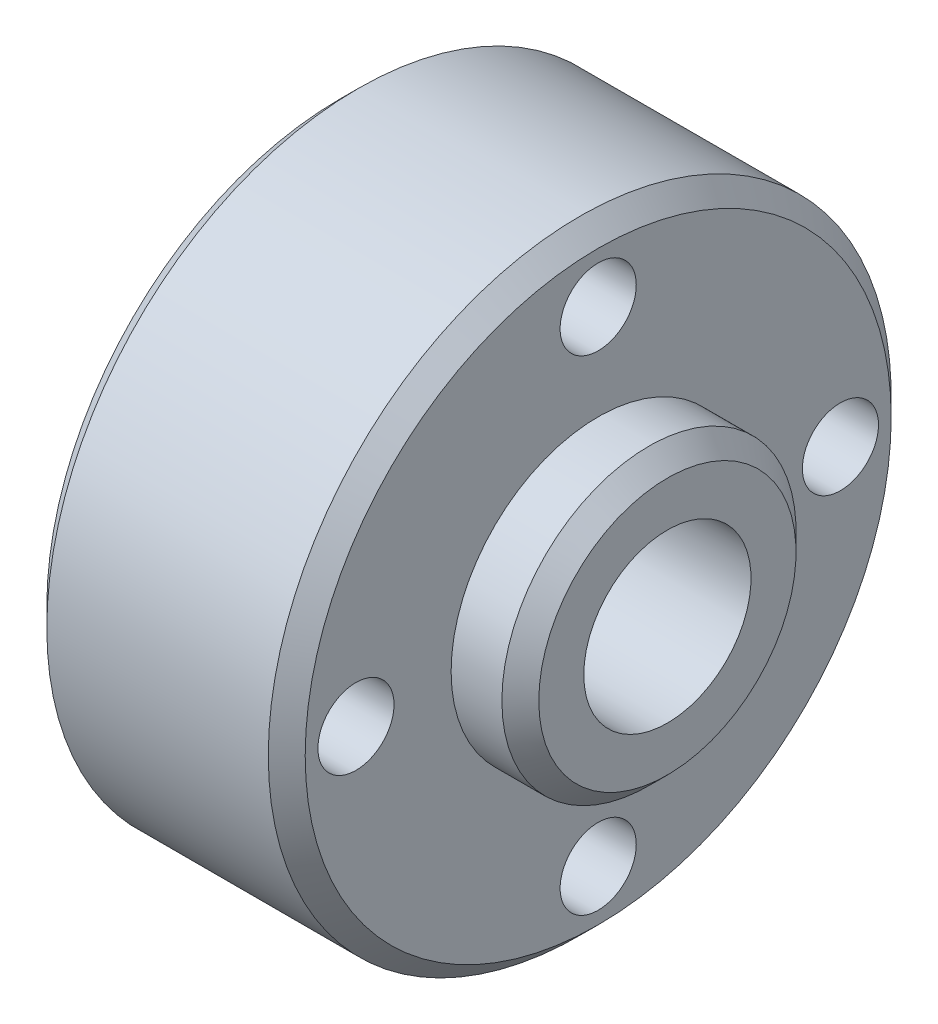
ISO-10303-21;
HEADER;
FILE_DESCRIPTION(('STEP AP214'),'2;1');
FILE_NAME('part.step','',(''),(''),'','','');
FILE_SCHEMA(('AUTOMOTIVE_DESIGN { 1 0 10303 214 1 1 1 1 }'));
ENDSEC;
DATA;
#1=APPLICATION_CONTEXT('core data for automotive mechanical design processes');
#2=APPLICATION_PROTOCOL_DEFINITION('international standard','automotive_design',2000,#1);
#3=PRODUCT_CONTEXT('',#1,'mechanical');
#4=PRODUCT('Part','Part','',(#3));
#5=PRODUCT_RELATED_PRODUCT_CATEGORY('part','',(#4));
#6=PRODUCT_DEFINITION_FORMATION('','',#4);
#7=PRODUCT_DEFINITION_CONTEXT('part definition',#1,'design');
#8=PRODUCT_DEFINITION('design','',#6,#7);
#9=PRODUCT_DEFINITION_SHAPE('','',#8);
#10=(LENGTH_UNIT() NAMED_UNIT(*) SI_UNIT(.MILLI.,.METRE.));
#11=(NAMED_UNIT(*) PLANE_ANGLE_UNIT() SI_UNIT($,.RADIAN.));
#12=(NAMED_UNIT(*) SI_UNIT($,.STERADIAN.) SOLID_ANGLE_UNIT());
#13=UNCERTAINTY_MEASURE_WITH_UNIT(LENGTH_MEASURE(1.E-05),#10,'distance_accuracy_value','');
#14=(GEOMETRIC_REPRESENTATION_CONTEXT(3) GLOBAL_UNCERTAINTY_ASSIGNED_CONTEXT((#13)) GLOBAL_UNIT_ASSIGNED_CONTEXT((#10,
#11,#12)) REPRESENTATION_CONTEXT('',''));
#15=CARTESIAN_POINT('',(0.,0.,0.));
#16=DIRECTION('',(0.,0.,1.));
#17=DIRECTION('',(1.,0.,0.));
#18=AXIS2_PLACEMENT_3D('',#15,#16,#17);
#19=CARTESIAN_POINT('',(7.,3.625,0.));
#20=DIRECTION('',(1.,0.,0.));
#21=DIRECTION('',(0.,0.,-1.));
#22=AXIS2_PLACEMENT_3D('',#19,#20,#21);
#23=PLANE('',#22);
#24=CARTESIAN_POINT('',(7.,0.,0.));
#25=DIRECTION('',(-1.,0.,0.));
#26=DIRECTION('',(0.,0.,1.));
#27=AXIS2_PLACEMENT_3D('',#24,#25,#26);
#28=CIRCLE('',#27,3.625);
#29=CARTESIAN_POINT('',(7.,0.,3.625));
#30=VERTEX_POINT('',#29);
#31=EDGE_CURVE('E64',#30,#30,#28,.T.);
#32=ORIENTED_EDGE('',*,*,#31,.F.);
#33=EDGE_LOOP('',(#32));
#34=FACE_BOUND('',#33,.T.);
#35=CARTESIAN_POINT('',(7.,0.,0.));
#36=DIRECTION('',(-1.,0.,0.));
#37=DIRECTION('',(0.,0.,1.));
#38=AXIS2_PLACEMENT_3D('',#35,#36,#37);
#39=CIRCLE('',#38,7.625);
#40=CARTESIAN_POINT('',(7.,0.,7.625));
#41=VERTEX_POINT('',#40);
#42=EDGE_CURVE('E73',#41,#41,#39,.T.);
#43=ORIENTED_EDGE('',*,*,#42,.T.);
#44=EDGE_LOOP('',(#43));
#45=FACE_BOUND('',#44,.T.);
#46=ADVANCED_FACE('F32',(#34,#45),#23,.F.);
#47=CARTESIAN_POINT('',(0.,0.,0.));
#48=DIRECTION('',(-1.,0.,0.));
#49=DIRECTION('',(0.,0.,1.));
#50=AXIS2_PLACEMENT_3D('',#47,#48,#49);
#51=CYLINDRICAL_SURFACE('',#50,3.625);
#52=CARTESIAN_POINT('',(14.2,0.,0.));
#53=DIRECTION('',(-1.,0.,0.));
#54=DIRECTION('',(0.,0.,1.));
#55=AXIS2_PLACEMENT_3D('',#52,#53,#54);
#56=CIRCLE('',#55,3.625);
#57=CARTESIAN_POINT('',(14.2,0.,3.625));
#58=VERTEX_POINT('',#57);
#59=EDGE_CURVE('E67',#58,#58,#56,.T.);
#60=ORIENTED_EDGE('',*,*,#59,.F.);
#61=EDGE_LOOP('',(#60));
#62=FACE_BOUND('',#61,.T.);
#63=ORIENTED_EDGE('',*,*,#31,.T.);
#64=EDGE_LOOP('',(#63));
#65=FACE_BOUND('',#64,.T.);
#66=ADVANCED_FACE('F134',(#62,#65),#51,.F.);
#67=CARTESIAN_POINT('',(14.2,6.375,0.));
#68=DIRECTION('',(-1.,0.,0.));
#69=DIRECTION('',(0.,0.,1.));
#70=AXIS2_PLACEMENT_3D('',#67,#68,#69);
#71=PLANE('',#70);
#72=CARTESIAN_POINT('',(14.2,0.,0.));
#73=DIRECTION('',(-1.,0.,0.));
#74=DIRECTION('',(0.,0.,1.));
#75=AXIS2_PLACEMENT_3D('',#72,#73,#74);
#76=CIRCLE('',#75,5.57499999999999);
#77=CARTESIAN_POINT('',(14.2,0.,5.57499999999999));
#78=VERTEX_POINT('',#77);
#79=EDGE_CURVE('E39',#78,#78,#76,.F.);
#80=ORIENTED_EDGE('',*,*,#79,.T.);
#81=EDGE_LOOP('',(#80));
#82=FACE_BOUND('',#81,.T.);
#83=ORIENTED_EDGE('',*,*,#59,.T.);
#84=EDGE_LOOP('',(#83));
#85=FACE_BOUND('',#84,.T.);
#86=ADVANCED_FACE('F128',(#82,#85),#71,.F.);
#87=CARTESIAN_POINT('',(0.,0.,0.));
#88=DIRECTION('',(-1.,0.,0.));
#89=DIRECTION('',(0.,0.,1.));
#90=AXIS2_PLACEMENT_3D('',#87,#88,#89);
#91=CYLINDRICAL_SURFACE('',#90,6.375);
#92=CARTESIAN_POINT('',(13.4,0.,0.));
#93=DIRECTION('',(-1.,0.,0.));
#94=DIRECTION('',(0.,0.,1.));
#95=AXIS2_PLACEMENT_3D('',#92,#93,#94);
#96=CIRCLE('',#95,6.375);
#97=CARTESIAN_POINT('',(13.4,0.,6.375));
#98=VERTEX_POINT('',#97);
#99=EDGE_CURVE('E43',#98,#98,#96,.T.);
#100=ORIENTED_EDGE('',*,*,#99,.T.);
#101=EDGE_LOOP('',(#100));
#102=FACE_BOUND('',#101,.T.);
#103=CARTESIAN_POINT('',(11.2,0.,0.));
#104=DIRECTION('',(-1.,0.,0.));
#105=DIRECTION('',(0.,0.,1.));
#106=AXIS2_PLACEMENT_3D('',#103,#104,#105);
#107=CIRCLE('',#106,6.375);
#108=CARTESIAN_POINT('',(11.2,0.,6.375));
#109=VERTEX_POINT('',#108);
#110=EDGE_CURVE('E70',#109,#109,#107,.T.);
#111=ORIENTED_EDGE('',*,*,#110,.F.);
#112=EDGE_LOOP('',(#111));
#113=FACE_BOUND('',#112,.T.);
#114=ADVANCED_FACE('F116',(#102,#113),#91,.T.);
#115=CARTESIAN_POINT('',(11.2,13.5,0.));
#116=DIRECTION('',(-1.,0.,0.));
#117=DIRECTION('',(0.,0.,1.));
#118=AXIS2_PLACEMENT_3D('',#115,#116,#117);
#119=PLANE('',#118);
#120=CARTESIAN_POINT('',(11.2,0.,0.));
#121=DIRECTION('',(-1.,0.,0.));
#122=DIRECTION('',(0.,0.,1.));
#123=AXIS2_PLACEMENT_3D('',#120,#121,#122);
#124=CIRCLE('',#123,12.7);
#125=CARTESIAN_POINT('',(11.2,0.,12.7));
#126=VERTEX_POINT('',#125);
#127=EDGE_CURVE('E55',#126,#126,#124,.F.);
#128=ORIENTED_EDGE('',*,*,#127,.T.);
#129=EDGE_LOOP('',(#128));
#130=FACE_BOUND('',#129,.T.);
#131=CARTESIAN_POINT('',(11.2,10.5,0.));
#132=DIRECTION('',(1.,0.,0.));
#133=DIRECTION('',(0.,0.,-1.));
#134=AXIS2_PLACEMENT_3D('',#131,#132,#133);
#135=CIRCLE('',#134,1.65);
#136=CARTESIAN_POINT('',(11.2,10.5,-1.65));
#137=VERTEX_POINT('',#136);
#138=EDGE_CURVE('E95',#137,#137,#135,.T.);
#139=ORIENTED_EDGE('',*,*,#138,.F.);
#140=EDGE_LOOP('',(#139));
#141=FACE_BOUND('',#140,.T.);
#142=CARTESIAN_POINT('',(11.2,0.,-10.5));
#143=DIRECTION('',(1.,0.,0.));
#144=DIRECTION('',(0.,0.,-1.));
#145=AXIS2_PLACEMENT_3D('',#142,#143,#144);
#146=CIRCLE('',#145,1.65);
#147=CARTESIAN_POINT('',(11.2,0.,-12.15));
#148=VERTEX_POINT('',#147);
#149=EDGE_CURVE('E89',#148,#148,#146,.T.);
#150=ORIENTED_EDGE('',*,*,#149,.F.);
#151=EDGE_LOOP('',(#150));
#152=FACE_BOUND('',#151,.T.);
#153=CARTESIAN_POINT('',(11.2,-10.5,0.));
#154=DIRECTION('',(1.,0.,0.));
#155=DIRECTION('',(0.,0.,-1.));
#156=AXIS2_PLACEMENT_3D('',#153,#154,#155);
#157=CIRCLE('',#156,1.65);
#158=CARTESIAN_POINT('',(11.2,-10.5,-1.65));
#159=VERTEX_POINT('',#158);
#160=EDGE_CURVE('E83',#159,#159,#157,.T.);
#161=ORIENTED_EDGE('',*,*,#160,.F.);
#162=EDGE_LOOP('',(#161));
#163=FACE_BOUND('',#162,.T.);
#164=CARTESIAN_POINT('',(11.2,0.,10.5));
#165=DIRECTION('',(1.,0.,0.));
#166=DIRECTION('',(0.,0.,-1.));
#167=AXIS2_PLACEMENT_3D('',#164,#165,#166);
#168=CIRCLE('',#167,1.65);
#169=CARTESIAN_POINT('',(11.2,0.,8.85));
#170=VERTEX_POINT('',#169);
#171=EDGE_CURVE('E77',#170,#170,#168,.T.);
#172=ORIENTED_EDGE('',*,*,#171,.F.);
#173=EDGE_LOOP('',(#172));
#174=FACE_BOUND('',#173,.T.);
#175=ORIENTED_EDGE('',*,*,#110,.T.);
#176=EDGE_LOOP('',(#175));
#177=FACE_BOUND('',#176,.T.);
#178=ADVANCED_FACE('F112',(#130,#141,#152,#163,#174,#177),#119,.F.);
#179=CARTESIAN_POINT('',(0.,0.,0.));
#180=DIRECTION('',(-1.,0.,0.));
#181=DIRECTION('',(0.,0.,1.));
#182=AXIS2_PLACEMENT_3D('',#179,#180,#181);
#183=CYLINDRICAL_SURFACE('',#182,13.5);
#184=CARTESIAN_POINT('',(10.4,0.,0.));
#185=DIRECTION('',(-1.,0.,0.));
#186=DIRECTION('',(0.,0.,1.));
#187=AXIS2_PLACEMENT_3D('',#184,#185,#186);
#188=CIRCLE('',#187,13.5);
#189=CARTESIAN_POINT('',(10.4,0.,13.5));
#190=VERTEX_POINT('',#189);
#191=EDGE_CURVE('E58',#190,#190,#188,.T.);
#192=ORIENTED_EDGE('',*,*,#191,.T.);
#193=EDGE_LOOP('',(#192));
#194=FACE_BOUND('',#193,.T.);
#195=CARTESIAN_POINT('',(0.8,0.,0.));
#196=DIRECTION('',(1.,0.,0.));
#197=DIRECTION('',(0.,0.,-1.));
#198=AXIS2_PLACEMENT_3D('',#195,#196,#197);
#199=CIRCLE('',#198,13.5);
#200=CARTESIAN_POINT('',(0.8,0.,-13.5));
#201=VERTEX_POINT('',#200);
#202=EDGE_CURVE('E61',#201,#201,#199,.T.);
#203=ORIENTED_EDGE('',*,*,#202,.T.);
#204=EDGE_LOOP('',(#203));
#205=FACE_BOUND('',#204,.T.);
#206=ADVANCED_FACE('F115',(#194,#205),#183,.T.);
#207=CARTESIAN_POINT('',(0.,7.625,0.));
#208=DIRECTION('',(1.,0.,0.));
#209=DIRECTION('',(0.,0.,-1.));
#210=AXIS2_PLACEMENT_3D('',#207,#208,#209);
#211=PLANE('',#210);
#212=CARTESIAN_POINT('',(0.,0.,0.));
#213=DIRECTION('',(1.,0.,0.));
#214=DIRECTION('',(0.,0.,-1.));
#215=AXIS2_PLACEMENT_3D('',#212,#213,#214);
#216=CIRCLE('',#215,12.7);
#217=CARTESIAN_POINT('',(0.,0.,-12.7));
#218=VERTEX_POINT('',#217);
#219=EDGE_CURVE('E47',#218,#218,#216,.F.);
#220=ORIENTED_EDGE('',*,*,#219,.T.);
#221=EDGE_LOOP('',(#220));
#222=FACE_BOUND('',#221,.T.);
#223=CARTESIAN_POINT('',(0.,0.,0.));
#224=DIRECTION('',(1.,0.,0.));
#225=DIRECTION('',(0.,0.,-1.));
#226=AXIS2_PLACEMENT_3D('',#223,#224,#225);
#227=CIRCLE('',#226,8.425);
#228=CARTESIAN_POINT('',(0.,0.,-8.425));
#229=VERTEX_POINT('',#228);
#230=EDGE_CURVE('E52',#229,#229,#227,.T.);
#231=ORIENTED_EDGE('',*,*,#230,.T.);
#232=EDGE_LOOP('',(#231));
#233=FACE_BOUND('',#232,.T.);
#234=CARTESIAN_POINT('',(0.,10.5,0.));
#235=DIRECTION('',(1.,0.,0.));
#236=DIRECTION('',(0.,0.,-1.));
#237=AXIS2_PLACEMENT_3D('',#234,#235,#236);
#238=CIRCLE('',#237,1.65);
#239=CARTESIAN_POINT('',(0.,10.5,-1.65));
#240=VERTEX_POINT('',#239);
#241=EDGE_CURVE('E76',#240,#240,#238,.T.);
#242=ORIENTED_EDGE('',*,*,#241,.T.);
#243=EDGE_LOOP('',(#242));
#244=FACE_BOUND('',#243,.T.);
#245=CARTESIAN_POINT('',(0.,0.,-10.5));
#246=DIRECTION('',(1.,0.,0.));
#247=DIRECTION('',(0.,0.,-1.));
#248=AXIS2_PLACEMENT_3D('',#245,#246,#247);
#249=CIRCLE('',#248,1.65);
#250=CARTESIAN_POINT('',(0.,0.,-12.15));
#251=VERTEX_POINT('',#250);
#252=EDGE_CURVE('E92',#251,#251,#249,.T.);
#253=ORIENTED_EDGE('',*,*,#252,.T.);
#254=EDGE_LOOP('',(#253));
#255=FACE_BOUND('',#254,.T.);
#256=CARTESIAN_POINT('',(0.,-10.5,0.));
#257=DIRECTION('',(1.,0.,0.));
#258=DIRECTION('',(0.,0.,-1.));
#259=AXIS2_PLACEMENT_3D('',#256,#257,#258);
#260=CIRCLE('',#259,1.65);
#261=CARTESIAN_POINT('',(0.,-10.5,-1.65));
#262=VERTEX_POINT('',#261);
#263=EDGE_CURVE('E86',#262,#262,#260,.T.);
#264=ORIENTED_EDGE('',*,*,#263,.T.);
#265=EDGE_LOOP('',(#264));
#266=FACE_BOUND('',#265,.T.);
#267=CARTESIAN_POINT('',(0.,0.,10.5));
#268=DIRECTION('',(1.,0.,0.));
#269=DIRECTION('',(0.,0.,-1.));
#270=AXIS2_PLACEMENT_3D('',#267,#268,#269);
#271=CIRCLE('',#270,1.65);
#272=CARTESIAN_POINT('',(0.,0.,8.85));
#273=VERTEX_POINT('',#272);
#274=EDGE_CURVE('E80',#273,#273,#271,.T.);
#275=ORIENTED_EDGE('',*,*,#274,.T.);
#276=EDGE_LOOP('',(#275));
#277=FACE_BOUND('',#276,.T.);
#278=ADVANCED_FACE('F101',(#222,#233,#244,#255,#266,#277),#211,.F.);
#279=CARTESIAN_POINT('',(0.,0.,0.));
#280=DIRECTION('',(-1.,0.,0.));
#281=DIRECTION('',(0.,0.,1.));
#282=AXIS2_PLACEMENT_3D('',#279,#280,#281);
#283=CYLINDRICAL_SURFACE('',#282,7.625);
#284=CARTESIAN_POINT('',(0.800000000000004,0.,0.));
#285=DIRECTION('',(1.,0.,0.));
#286=DIRECTION('',(0.,0.,-1.));
#287=AXIS2_PLACEMENT_3D('',#284,#285,#286);
#288=CIRCLE('',#287,7.625);
#289=CARTESIAN_POINT('',(0.800000000000004,0.,-7.625));
#290=VERTEX_POINT('',#289);
#291=EDGE_CURVE('E10',#290,#290,#288,.F.);
#292=ORIENTED_EDGE('',*,*,#291,.T.);
#293=EDGE_LOOP('',(#292));
#294=FACE_BOUND('',#293,.T.);
#295=ORIENTED_EDGE('',*,*,#42,.F.);
#296=EDGE_LOOP('',(#295));
#297=FACE_BOUND('',#296,.T.);
#298=ADVANCED_FACE('F168',(#294,#297),#283,.F.);
#299=CARTESIAN_POINT('',(0.,0.,10.5));
#300=DIRECTION('',(1.,0.,0.));
#301=DIRECTION('',(0.,0.,-1.));
#302=AXIS2_PLACEMENT_3D('',#299,#300,#301);
#303=CYLINDRICAL_SURFACE('',#302,1.65);
#304=ORIENTED_EDGE('',*,*,#274,.F.);
#305=EDGE_LOOP('',(#304));
#306=FACE_BOUND('',#305,.T.);
#307=ORIENTED_EDGE('',*,*,#171,.T.);
#308=EDGE_LOOP('',(#307));
#309=FACE_BOUND('',#308,.T.);
#310=ADVANCED_FACE('F175',(#306,#309),#303,.F.);
#311=CARTESIAN_POINT('',(0.,-10.5,0.));
#312=DIRECTION('',(1.,0.,0.));
#313=DIRECTION('',(0.,0.,-1.));
#314=AXIS2_PLACEMENT_3D('',#311,#312,#313);
#315=CYLINDRICAL_SURFACE('',#314,1.65);
#316=ORIENTED_EDGE('',*,*,#263,.F.);
#317=EDGE_LOOP('',(#316));
#318=FACE_BOUND('',#317,.T.);
#319=ORIENTED_EDGE('',*,*,#160,.T.);
#320=EDGE_LOOP('',(#319));
#321=FACE_BOUND('',#320,.T.);
#322=ADVANCED_FACE('F182',(#318,#321),#315,.F.);
#323=CARTESIAN_POINT('',(0.,0.,-10.5));
#324=DIRECTION('',(1.,0.,0.));
#325=DIRECTION('',(0.,0.,-1.));
#326=AXIS2_PLACEMENT_3D('',#323,#324,#325);
#327=CYLINDRICAL_SURFACE('',#326,1.65);
#328=ORIENTED_EDGE('',*,*,#252,.F.);
#329=EDGE_LOOP('',(#328));
#330=FACE_BOUND('',#329,.T.);
#331=ORIENTED_EDGE('',*,*,#149,.T.);
#332=EDGE_LOOP('',(#331));
#333=FACE_BOUND('',#332,.T.);
#334=ADVANCED_FACE('F108',(#330,#333),#327,.F.);
#335=CARTESIAN_POINT('',(0.,10.5,0.));
#336=DIRECTION('',(1.,0.,0.));
#337=DIRECTION('',(0.,0.,-1.));
#338=AXIS2_PLACEMENT_3D('',#335,#336,#337);
#339=CYLINDRICAL_SURFACE('',#338,1.65);
#340=ORIENTED_EDGE('',*,*,#241,.F.);
#341=EDGE_LOOP('',(#340));
#342=FACE_BOUND('',#341,.T.);
#343=ORIENTED_EDGE('',*,*,#138,.T.);
#344=EDGE_LOOP('',(#343));
#345=FACE_BOUND('',#344,.T.);
#346=ADVANCED_FACE('F104',(#342,#345),#339,.F.);
#347=CARTESIAN_POINT('',(10.4,0.,0.));
#348=DIRECTION('',(-1.,0.,0.));
#349=DIRECTION('',(0.,0.,1.));
#350=AXIS2_PLACEMENT_3D('',#347,#348,#349);
#351=CONICAL_SURFACE('',#350,13.5,0.785398163397449);
#352=ORIENTED_EDGE('',*,*,#127,.F.);
#353=EDGE_LOOP('',(#352));
#354=FACE_BOUND('',#353,.T.);
#355=ORIENTED_EDGE('',*,*,#191,.F.);
#356=EDGE_LOOP('',(#355));
#357=FACE_BOUND('',#356,.T.);
#358=ADVANCED_FACE('F107',(#354,#357),#351,.T.);
#359=CARTESIAN_POINT('',(0.,0.,0.));
#360=DIRECTION('',(1.,0.,0.));
#361=DIRECTION('',(0.,0.,-1.));
#362=AXIS2_PLACEMENT_3D('',#359,#360,#361);
#363=CONICAL_SURFACE('',#362,12.7,0.785398163397442);
#364=ORIENTED_EDGE('',*,*,#202,.F.);
#365=EDGE_LOOP('',(#364));
#366=FACE_BOUND('',#365,.T.);
#367=ORIENTED_EDGE('',*,*,#219,.F.);
#368=EDGE_LOOP('',(#367));
#369=FACE_BOUND('',#368,.T.);
#370=ADVANCED_FACE('F149',(#366,#369),#363,.T.);
#371=CARTESIAN_POINT('',(13.4,0.,0.));
#372=DIRECTION('',(-1.,0.,0.));
#373=DIRECTION('',(0.,0.,1.));
#374=AXIS2_PLACEMENT_3D('',#371,#372,#373);
#375=CONICAL_SURFACE('',#374,6.375,0.785398163397452);
#376=ORIENTED_EDGE('',*,*,#79,.F.);
#377=EDGE_LOOP('',(#376));
#378=FACE_BOUND('',#377,.T.);
#379=ORIENTED_EDGE('',*,*,#99,.F.);
#380=EDGE_LOOP('',(#379));
#381=FACE_BOUND('',#380,.T.);
#382=ADVANCED_FACE('F152',(#378,#381),#375,.T.);
#383=CARTESIAN_POINT('',(0.800000000000004,0.,0.));
#384=DIRECTION('',(-1.,0.,0.));
#385=DIRECTION('',(0.,0.,1.));
#386=AXIS2_PLACEMENT_3D('',#383,#384,#385);
#387=CONICAL_SURFACE('',#386,7.625,0.785398163397447);
#388=ORIENTED_EDGE('',*,*,#230,.F.);
#389=EDGE_LOOP('',(#388));
#390=FACE_BOUND('',#389,.T.);
#391=ORIENTED_EDGE('',*,*,#291,.F.);
#392=EDGE_LOOP('',(#391));
#393=FACE_BOUND('',#392,.T.);
#394=ADVANCED_FACE('F34',(#390,#393),#387,.F.);
#395=CLOSED_SHELL('',(#46,#66,#86,#114,#178,#206,#278,#298,#310,#322,#334,#346,#358,#370,#382,#394));
#396=MANIFOLD_SOLID_BREP('B2',#395);
#397=ADVANCED_BREP_SHAPE_REPRESENTATION('',(#18,#396),#14);
#398=SHAPE_DEFINITION_REPRESENTATION(#9,#397);
ENDSEC;
END-ISO-10303-21;
